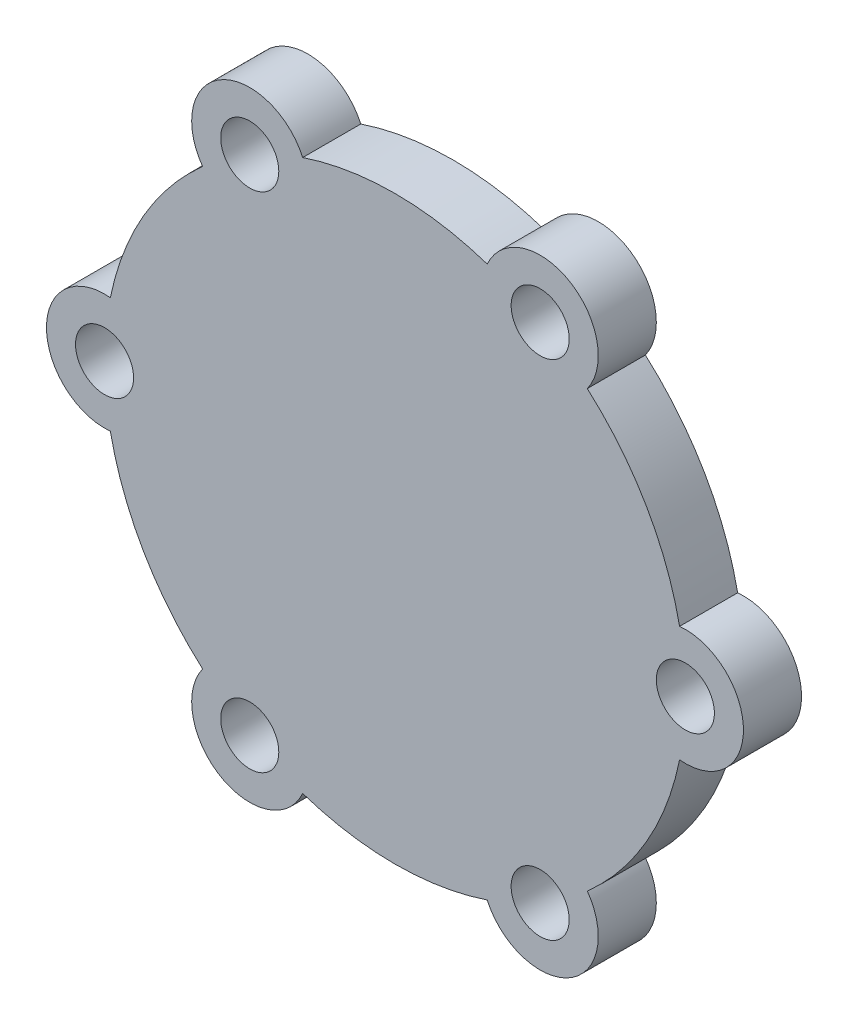
ISO-10303-21;
HEADER;
FILE_DESCRIPTION(('STEP AP214'),'2;1');
FILE_NAME('part.step','',(''),(''),'','','');
FILE_SCHEMA(('AUTOMOTIVE_DESIGN { 1 0 10303 214 1 1 1 1 }'));
ENDSEC;
DATA;
#1=APPLICATION_CONTEXT('core data for automotive mechanical design processes');
#2=APPLICATION_PROTOCOL_DEFINITION('international standard','automotive_design',2000,#1);
#3=PRODUCT_CONTEXT('',#1,'mechanical');
#4=PRODUCT('Part','Part','',(#3));
#5=PRODUCT_RELATED_PRODUCT_CATEGORY('part','',(#4));
#6=PRODUCT_DEFINITION_FORMATION('','',#4);
#7=PRODUCT_DEFINITION_CONTEXT('part definition',#1,'design');
#8=PRODUCT_DEFINITION('design','',#6,#7);
#9=PRODUCT_DEFINITION_SHAPE('','',#8);
#10=(LENGTH_UNIT() NAMED_UNIT(*) SI_UNIT(.MILLI.,.METRE.));
#11=(NAMED_UNIT(*) PLANE_ANGLE_UNIT() SI_UNIT($,.RADIAN.));
#12=(NAMED_UNIT(*) SI_UNIT($,.STERADIAN.) SOLID_ANGLE_UNIT());
#13=UNCERTAINTY_MEASURE_WITH_UNIT(LENGTH_MEASURE(1.E-05),#10,'distance_accuracy_value','');
#14=(GEOMETRIC_REPRESENTATION_CONTEXT(3) GLOBAL_UNCERTAINTY_ASSIGNED_CONTEXT((#13)) GLOBAL_UNIT_ASSIGNED_CONTEXT((#10,
#11,#12)) REPRESENTATION_CONTEXT('',''));
#15=CARTESIAN_POINT('',(0.,0.,0.));
#16=DIRECTION('',(0.,0.,1.));
#17=DIRECTION('',(1.,0.,0.));
#18=AXIS2_PLACEMENT_3D('',#15,#16,#17);
#19=CARTESIAN_POINT('',(25.,0.,10.));
#20=DIRECTION('',(0.,0.,1.));
#21=DIRECTION('',(1.,0.,0.));
#22=AXIS2_PLACEMENT_3D('',#19,#20,#21);
#23=PLANE('',#22);
#24=CARTESIAN_POINT('',(-24.9999999999996,43.3012701892222,10.));
#25=DIRECTION('',(0.,0.,1.));
#26=DIRECTION('',(1.,0.,0.));
#27=AXIS2_PLACEMENT_3D('',#24,#25,#26);
#28=CIRCLE('',#27,4.99999999999999);
#29=CARTESIAN_POINT('',(-19.9999999999996,43.3012701892222,10.));
#30=VERTEX_POINT('',#29);
#31=EDGE_CURVE('E303',#30,#30,#28,.T.);
#32=ORIENTED_EDGE('',*,*,#31,.F.);
#33=EDGE_LOOP('',(#32));
#34=FACE_BOUND('',#33,.T.);
#35=CARTESIAN_POINT('',(-25.0000000000002,-43.3012701892218,10.));
#36=DIRECTION('',(0.,0.,1.));
#37=DIRECTION('',(1.,0.,0.));
#38=AXIS2_PLACEMENT_3D('',#35,#36,#37);
#39=CIRCLE('',#38,5.);
#40=CARTESIAN_POINT('',(-20.0000000000002,-43.3012701892218,10.));
#41=VERTEX_POINT('',#40);
#42=EDGE_CURVE('E315',#41,#41,#39,.T.);
#43=ORIENTED_EDGE('',*,*,#42,.F.);
#44=EDGE_LOOP('',(#43));
#45=FACE_BOUND('',#44,.T.);
#46=CARTESIAN_POINT('',(50.,0.,10.));
#47=DIRECTION('',(0.,0.,1.));
#48=DIRECTION('',(1.,0.,0.));
#49=AXIS2_PLACEMENT_3D('',#46,#47,#48);
#50=CIRCLE('',#49,5.);
#51=CARTESIAN_POINT('',(55.,0.,10.));
#52=VERTEX_POINT('',#51);
#53=EDGE_CURVE('E162',#52,#52,#50,.T.);
#54=ORIENTED_EDGE('',*,*,#53,.F.);
#55=EDGE_LOOP('',(#54));
#56=FACE_BOUND('',#55,.T.);
#57=CARTESIAN_POINT('',(0.,0.,10.));
#58=DIRECTION('',(0.,0.,1.));
#59=DIRECTION('',(1.,0.,0.));
#60=AXIS2_PLACEMENT_3D('',#57,#58,#59);
#61=CIRCLE('',#60,50.);
#62=CARTESIAN_POINT('',(33.116843969807,-37.4603075999045,10.));
#63=VERTEX_POINT('',#62);
#64=CARTESIAN_POINT('',(49.,-9.94987437106621,10.));
#65=VERTEX_POINT('',#64);
#66=EDGE_CURVE('E181',#63,#65,#61,.T.);
#67=ORIENTED_EDGE('',*,*,#66,.T.);
#68=CARTESIAN_POINT('',(50.,0.,10.));
#69=DIRECTION('',(0.,0.,1.));
#70=DIRECTION('',(1.,0.,0.));
#71=AXIS2_PLACEMENT_3D('',#68,#69,#70);
#72=CIRCLE('',#71,10.);
#73=CARTESIAN_POINT('',(49.,9.94987437106621,10.));
#74=VERTEX_POINT('',#73);
#75=EDGE_CURVE('E109',#65,#74,#72,.T.);
#76=ORIENTED_EDGE('',*,*,#75,.T.);
#77=CARTESIAN_POINT('',(0.,0.,10.));
#78=DIRECTION('',(0.,0.,1.));
#79=DIRECTION('',(1.,0.,0.));
#80=AXIS2_PLACEMENT_3D('',#77,#78,#79);
#81=CIRCLE('',#80,50.);
#82=CARTESIAN_POINT('',(33.1168439698075,37.460307599904,10.));
#83=VERTEX_POINT('',#82);
#84=EDGE_CURVE('E208',#74,#83,#81,.T.);
#85=ORIENTED_EDGE('',*,*,#84,.T.);
#86=CARTESIAN_POINT('',(25.0000000000005,43.3012701892216,10.));
#87=DIRECTION('',(0.,0.,1.));
#88=DIRECTION('',(1.,0.,0.));
#89=AXIS2_PLACEMENT_3D('',#86,#87,#88);
#90=CIRCLE('',#89,10.);
#91=CARTESIAN_POINT('',(15.8831560301935,47.4101819709704,10.));
#92=VERTEX_POINT('',#91);
#93=EDGE_CURVE('E227',#83,#92,#90,.T.);
#94=ORIENTED_EDGE('',*,*,#93,.T.);
#95=CARTESIAN_POINT('',(0.,0.,10.));
#96=DIRECTION('',(0.,0.,1.));
#97=DIRECTION('',(1.,0.,0.));
#98=AXIS2_PLACEMENT_3D('',#95,#96,#97);
#99=CIRCLE('',#98,50.);
#100=CARTESIAN_POINT('',(-15.8831560301925,47.4101819709708,10.));
#101=VERTEX_POINT('',#100);
#102=EDGE_CURVE('E224',#92,#101,#99,.T.);
#103=ORIENTED_EDGE('',*,*,#102,.T.);
#104=CARTESIAN_POINT('',(-24.9999999999996,43.3012701892222,10.));
#105=DIRECTION('',(0.,0.,1.));
#106=DIRECTION('',(1.,0.,0.));
#107=AXIS2_PLACEMENT_3D('',#104,#105,#106);
#108=CIRCLE('',#107,10.);
#109=CARTESIAN_POINT('',(-33.1168439698067,37.4603075999047,10.));
#110=VERTEX_POINT('',#109);
#111=EDGE_CURVE('E226',#101,#110,#108,.T.);
#112=ORIENTED_EDGE('',*,*,#111,.T.);
#113=CARTESIAN_POINT('',(0.,0.,10.));
#114=DIRECTION('',(0.,0.,1.));
#115=DIRECTION('',(1.,0.,0.));
#116=AXIS2_PLACEMENT_3D('',#113,#114,#115);
#117=CIRCLE('',#116,50.);
#118=CARTESIAN_POINT('',(-48.9999999999999,9.94987437106655,10.));
#119=VERTEX_POINT('',#118);
#120=EDGE_CURVE('E229',#110,#119,#117,.T.);
#121=ORIENTED_EDGE('',*,*,#120,.T.);
#122=CARTESIAN_POINT('',(-50.,3.49148133884313E-13,10.));
#123=DIRECTION('',(0.,0.,1.));
#124=DIRECTION('',(1.,0.,0.));
#125=AXIS2_PLACEMENT_3D('',#122,#123,#124);
#126=CIRCLE('',#125,10.);
#127=CARTESIAN_POINT('',(-49.0000000000001,-9.94987437106587,10.));
#128=VERTEX_POINT('',#127);
#129=EDGE_CURVE('E235',#119,#128,#126,.T.);
#130=ORIENTED_EDGE('',*,*,#129,.T.);
#131=CARTESIAN_POINT('',(0.,0.,10.));
#132=DIRECTION('',(0.,0.,1.));
#133=DIRECTION('',(1.,0.,0.));
#134=AXIS2_PLACEMENT_3D('',#131,#132,#133);
#135=CIRCLE('',#134,50.);
#136=CARTESIAN_POINT('',(-33.1168439698072,-37.4603075999042,10.));
#137=VERTEX_POINT('',#136);
#138=EDGE_CURVE('E140',#128,#137,#135,.T.);
#139=ORIENTED_EDGE('',*,*,#138,.T.);
#140=CARTESIAN_POINT('',(-25.0000000000002,-43.3012701892218,10.));
#141=DIRECTION('',(0.,0.,1.));
#142=DIRECTION('',(1.,0.,0.));
#143=AXIS2_PLACEMENT_3D('',#140,#141,#142);
#144=CIRCLE('',#143,10.);
#145=CARTESIAN_POINT('',(-15.8831560301932,-47.4101819709705,10.));
#146=VERTEX_POINT('',#145);
#147=EDGE_CURVE('E134',#137,#146,#144,.T.);
#148=ORIENTED_EDGE('',*,*,#147,.T.);
#149=CARTESIAN_POINT('',(0.,0.,10.));
#150=DIRECTION('',(0.,0.,1.));
#151=DIRECTION('',(1.,0.,0.));
#152=AXIS2_PLACEMENT_3D('',#149,#150,#151);
#153=CIRCLE('',#152,50.);
#154=CARTESIAN_POINT('',(15.8831560301928,-47.4101819709706,10.));
#155=VERTEX_POINT('',#154);
#156=EDGE_CURVE('E138',#146,#155,#153,.T.);
#157=ORIENTED_EDGE('',*,*,#156,.T.);
#158=CARTESIAN_POINT('',(24.9999999999999,-43.301270189222,10.));
#159=DIRECTION('',(0.,0.,1.));
#160=DIRECTION('',(1.,0.,0.));
#161=AXIS2_PLACEMENT_3D('',#158,#159,#160);
#162=CIRCLE('',#161,10.);
#163=EDGE_CURVE('E54',#155,#63,#162,.T.);
#164=ORIENTED_EDGE('',*,*,#163,.T.);
#165=EDGE_LOOP('',(#67,#76,#85,#94,#103,#112,#121,#130,#139,#148,#157,#164));
#166=FACE_BOUND('',#165,.T.);
#167=CARTESIAN_POINT('',(24.9999999999999,-43.301270189222,10.));
#168=DIRECTION('',(0.,0.,1.));
#169=DIRECTION('',(1.,0.,0.));
#170=AXIS2_PLACEMENT_3D('',#167,#168,#169);
#171=CIRCLE('',#170,5.);
#172=CARTESIAN_POINT('',(29.9999999999999,-43.301270189222,10.));
#173=VERTEX_POINT('',#172);
#174=EDGE_CURVE('E321',#173,#173,#171,.T.);
#175=ORIENTED_EDGE('',*,*,#174,.F.);
#176=EDGE_LOOP('',(#175));
#177=FACE_BOUND('',#176,.T.);
#178=CARTESIAN_POINT('',(-50.,3.49148133884313E-13,10.));
#179=DIRECTION('',(0.,0.,1.));
#180=DIRECTION('',(1.,0.,0.));
#181=AXIS2_PLACEMENT_3D('',#178,#179,#180);
#182=CIRCLE('',#181,4.99999999999999);
#183=CARTESIAN_POINT('',(-45.,3.49148133884313E-13,10.));
#184=VERTEX_POINT('',#183);
#185=EDGE_CURVE('E309',#184,#184,#182,.T.);
#186=ORIENTED_EDGE('',*,*,#185,.F.);
#187=EDGE_LOOP('',(#186));
#188=FACE_BOUND('',#187,.T.);
#189=CARTESIAN_POINT('',(25.0000000000005,43.3012701892216,10.));
#190=DIRECTION('',(0.,0.,1.));
#191=DIRECTION('',(1.,0.,0.));
#192=AXIS2_PLACEMENT_3D('',#189,#190,#191);
#193=CIRCLE('',#192,5.);
#194=CARTESIAN_POINT('',(30.0000000000005,43.3012701892216,10.));
#195=VERTEX_POINT('',#194);
#196=EDGE_CURVE('E294',#195,#195,#193,.T.);
#197=ORIENTED_EDGE('',*,*,#196,.F.);
#198=EDGE_LOOP('',(#197));
#199=FACE_BOUND('',#198,.T.);
#200=ADVANCED_FACE('F37',(#34,#45,#56,#166,#177,#188,#199),#23,.T.);
#201=CARTESIAN_POINT('',(25.,0.,0.));
#202=DIRECTION('',(0.,0.,1.));
#203=DIRECTION('',(1.,0.,0.));
#204=AXIS2_PLACEMENT_3D('',#201,#202,#203);
#205=PLANE('',#204);
#206=CARTESIAN_POINT('',(0.,0.,0.));
#207=DIRECTION('',(0.,0.,1.));
#208=DIRECTION('',(1.,0.,0.));
#209=AXIS2_PLACEMENT_3D('',#206,#207,#208);
#210=CIRCLE('',#209,50.);
#211=CARTESIAN_POINT('',(33.116843969807,-37.4603075999045,0.));
#212=VERTEX_POINT('',#211);
#213=CARTESIAN_POINT('',(49.,-9.94987437106621,0.));
#214=VERTEX_POINT('',#213);
#215=EDGE_CURVE('E158',#212,#214,#210,.T.);
#216=ORIENTED_EDGE('',*,*,#215,.F.);
#217=CARTESIAN_POINT('',(24.9999999999999,-43.301270189222,0.));
#218=DIRECTION('',(0.,0.,1.));
#219=DIRECTION('',(1.,0.,0.));
#220=AXIS2_PLACEMENT_3D('',#217,#218,#219);
#221=CIRCLE('',#220,10.);
#222=CARTESIAN_POINT('',(15.8831560301928,-47.4101819709706,0.));
#223=VERTEX_POINT('',#222);
#224=EDGE_CURVE('E101',#223,#212,#221,.T.);
#225=ORIENTED_EDGE('',*,*,#224,.F.);
#226=CARTESIAN_POINT('',(0.,0.,0.));
#227=DIRECTION('',(0.,0.,1.));
#228=DIRECTION('',(1.,0.,0.));
#229=AXIS2_PLACEMENT_3D('',#226,#227,#228);
#230=CIRCLE('',#229,50.);
#231=CARTESIAN_POINT('',(-15.8831560301932,-47.4101819709705,0.));
#232=VERTEX_POINT('',#231);
#233=EDGE_CURVE('E95',#232,#223,#230,.T.);
#234=ORIENTED_EDGE('',*,*,#233,.F.);
#235=CARTESIAN_POINT('',(-25.0000000000002,-43.3012701892218,0.));
#236=DIRECTION('',(0.,0.,1.));
#237=DIRECTION('',(1.,0.,0.));
#238=AXIS2_PLACEMENT_3D('',#235,#236,#237);
#239=CIRCLE('',#238,10.);
#240=CARTESIAN_POINT('',(-33.1168439698072,-37.4603075999042,0.));
#241=VERTEX_POINT('',#240);
#242=EDGE_CURVE('E148',#241,#232,#239,.T.);
#243=ORIENTED_EDGE('',*,*,#242,.F.);
#244=CARTESIAN_POINT('',(0.,0.,0.));
#245=DIRECTION('',(0.,0.,1.));
#246=DIRECTION('',(1.,0.,0.));
#247=AXIS2_PLACEMENT_3D('',#244,#245,#246);
#248=CIRCLE('',#247,50.);
#249=CARTESIAN_POINT('',(-49.0000000000001,-9.94987437106587,0.));
#250=VERTEX_POINT('',#249);
#251=EDGE_CURVE('E176',#250,#241,#248,.T.);
#252=ORIENTED_EDGE('',*,*,#251,.F.);
#253=CARTESIAN_POINT('',(-50.,3.49148133884313E-13,0.));
#254=DIRECTION('',(0.,0.,1.));
#255=DIRECTION('',(1.,0.,0.));
#256=AXIS2_PLACEMENT_3D('',#253,#254,#255);
#257=CIRCLE('',#256,10.);
#258=CARTESIAN_POINT('',(-48.9999999999999,9.94987437106655,0.));
#259=VERTEX_POINT('',#258);
#260=EDGE_CURVE('E174',#259,#250,#257,.T.);
#261=ORIENTED_EDGE('',*,*,#260,.F.);
#262=CARTESIAN_POINT('',(0.,0.,0.));
#263=DIRECTION('',(0.,0.,1.));
#264=DIRECTION('',(1.,0.,0.));
#265=AXIS2_PLACEMENT_3D('',#262,#263,#264);
#266=CIRCLE('',#265,50.);
#267=CARTESIAN_POINT('',(-33.1168439698067,37.4603075999047,0.));
#268=VERTEX_POINT('',#267);
#269=EDGE_CURVE('E172',#268,#259,#266,.T.);
#270=ORIENTED_EDGE('',*,*,#269,.F.);
#271=CARTESIAN_POINT('',(-24.9999999999996,43.3012701892222,0.));
#272=DIRECTION('',(0.,0.,1.));
#273=DIRECTION('',(1.,0.,0.));
#274=AXIS2_PLACEMENT_3D('',#271,#272,#273);
#275=CIRCLE('',#274,10.);
#276=CARTESIAN_POINT('',(-15.8831560301925,47.4101819709708,0.));
#277=VERTEX_POINT('',#276);
#278=EDGE_CURVE('E170',#277,#268,#275,.T.);
#279=ORIENTED_EDGE('',*,*,#278,.F.);
#280=CARTESIAN_POINT('',(0.,0.,0.));
#281=DIRECTION('',(0.,0.,1.));
#282=DIRECTION('',(1.,0.,0.));
#283=AXIS2_PLACEMENT_3D('',#280,#281,#282);
#284=CIRCLE('',#283,50.);
#285=CARTESIAN_POINT('',(15.8831560301935,47.4101819709704,0.));
#286=VERTEX_POINT('',#285);
#287=EDGE_CURVE('E168',#286,#277,#284,.T.);
#288=ORIENTED_EDGE('',*,*,#287,.F.);
#289=CARTESIAN_POINT('',(25.0000000000005,43.3012701892216,0.));
#290=DIRECTION('',(0.,0.,1.));
#291=DIRECTION('',(1.,0.,0.));
#292=AXIS2_PLACEMENT_3D('',#289,#290,#291);
#293=CIRCLE('',#292,10.);
#294=CARTESIAN_POINT('',(33.1168439698075,37.460307599904,0.));
#295=VERTEX_POINT('',#294);
#296=EDGE_CURVE('E166',#295,#286,#293,.T.);
#297=ORIENTED_EDGE('',*,*,#296,.F.);
#298=CARTESIAN_POINT('',(0.,0.,0.));
#299=DIRECTION('',(0.,0.,1.));
#300=DIRECTION('',(1.,0.,0.));
#301=AXIS2_PLACEMENT_3D('',#298,#299,#300);
#302=CIRCLE('',#301,50.);
#303=CARTESIAN_POINT('',(49.,9.94987437106621,0.));
#304=VERTEX_POINT('',#303);
#305=EDGE_CURVE('E164',#304,#295,#302,.T.);
#306=ORIENTED_EDGE('',*,*,#305,.F.);
#307=CARTESIAN_POINT('',(50.,0.,0.));
#308=DIRECTION('',(0.,0.,1.));
#309=DIRECTION('',(1.,0.,0.));
#310=AXIS2_PLACEMENT_3D('',#307,#308,#309);
#311=CIRCLE('',#310,10.);
#312=EDGE_CURVE('E161',#214,#304,#311,.T.);
#313=ORIENTED_EDGE('',*,*,#312,.F.);
#314=EDGE_LOOP('',(#216,#225,#234,#243,#252,#261,#270,#279,#288,#297,#306,#313));
#315=FACE_BOUND('',#314,.T.);
#316=CARTESIAN_POINT('',(50.,0.,0.));
#317=DIRECTION('',(0.,0.,1.));
#318=DIRECTION('',(1.,0.,0.));
#319=AXIS2_PLACEMENT_3D('',#316,#317,#318);
#320=CIRCLE('',#319,5.);
#321=CARTESIAN_POINT('',(55.,0.,0.));
#322=VERTEX_POINT('',#321);
#323=EDGE_CURVE('E324',#322,#322,#320,.T.);
#324=ORIENTED_EDGE('',*,*,#323,.T.);
#325=EDGE_LOOP('',(#324));
#326=FACE_BOUND('',#325,.T.);
#327=CARTESIAN_POINT('',(24.9999999999999,-43.301270189222,0.));
#328=DIRECTION('',(0.,0.,1.));
#329=DIRECTION('',(1.,0.,0.));
#330=AXIS2_PLACEMENT_3D('',#327,#328,#329);
#331=CIRCLE('',#330,5.);
#332=CARTESIAN_POINT('',(29.9999999999999,-43.301270189222,0.));
#333=VERTEX_POINT('',#332);
#334=EDGE_CURVE('E318',#333,#333,#331,.T.);
#335=ORIENTED_EDGE('',*,*,#334,.T.);
#336=EDGE_LOOP('',(#335));
#337=FACE_BOUND('',#336,.T.);
#338=CARTESIAN_POINT('',(-25.0000000000002,-43.3012701892218,0.));
#339=DIRECTION('',(0.,0.,1.));
#340=DIRECTION('',(1.,0.,0.));
#341=AXIS2_PLACEMENT_3D('',#338,#339,#340);
#342=CIRCLE('',#341,5.);
#343=CARTESIAN_POINT('',(-20.0000000000002,-43.3012701892218,0.));
#344=VERTEX_POINT('',#343);
#345=EDGE_CURVE('E312',#344,#344,#342,.T.);
#346=ORIENTED_EDGE('',*,*,#345,.T.);
#347=EDGE_LOOP('',(#346));
#348=FACE_BOUND('',#347,.T.);
#349=CARTESIAN_POINT('',(-50.,3.49148133884313E-13,0.));
#350=DIRECTION('',(0.,0.,1.));
#351=DIRECTION('',(1.,0.,0.));
#352=AXIS2_PLACEMENT_3D('',#349,#350,#351);
#353=CIRCLE('',#352,4.99999999999999);
#354=CARTESIAN_POINT('',(-45.,3.49148133884313E-13,0.));
#355=VERTEX_POINT('',#354);
#356=EDGE_CURVE('E306',#355,#355,#353,.T.);
#357=ORIENTED_EDGE('',*,*,#356,.T.);
#358=EDGE_LOOP('',(#357));
#359=FACE_BOUND('',#358,.T.);
#360=CARTESIAN_POINT('',(-24.9999999999996,43.3012701892222,0.));
#361=DIRECTION('',(0.,0.,1.));
#362=DIRECTION('',(1.,0.,0.));
#363=AXIS2_PLACEMENT_3D('',#360,#361,#362);
#364=CIRCLE('',#363,4.99999999999999);
#365=CARTESIAN_POINT('',(-19.9999999999996,43.3012701892222,0.));
#366=VERTEX_POINT('',#365);
#367=EDGE_CURVE('E300',#366,#366,#364,.T.);
#368=ORIENTED_EDGE('',*,*,#367,.T.);
#369=EDGE_LOOP('',(#368));
#370=FACE_BOUND('',#369,.T.);
#371=CARTESIAN_POINT('',(25.0000000000005,43.3012701892216,0.));
#372=DIRECTION('',(0.,0.,1.));
#373=DIRECTION('',(1.,0.,0.));
#374=AXIS2_PLACEMENT_3D('',#371,#372,#373);
#375=CIRCLE('',#374,5.);
#376=CARTESIAN_POINT('',(30.0000000000005,43.3012701892216,0.));
#377=VERTEX_POINT('',#376);
#378=EDGE_CURVE('E297',#377,#377,#375,.T.);
#379=ORIENTED_EDGE('',*,*,#378,.T.);
#380=EDGE_LOOP('',(#379));
#381=FACE_BOUND('',#380,.T.);
#382=ADVANCED_FACE('F212',(#315,#326,#337,#348,#359,#370,#381),#205,.F.);
#383=CARTESIAN_POINT('',(0.,0.,10.));
#384=DIRECTION('',(0.,0.,-1.));
#385=DIRECTION('',(-1.,0.,0.));
#386=AXIS2_PLACEMENT_3D('',#383,#384,#385);
#387=CYLINDRICAL_SURFACE('',#386,50.);
#388=ORIENTED_EDGE('',*,*,#215,.T.);
#389=DIRECTION('',(0.,0.,-1.));
#390=VECTOR('',#389,1.);
#391=CARTESIAN_POINT('',(49.,-9.94987437106621,10.));
#392=LINE('',#391,#390);
#393=EDGE_CURVE('E11',#65,#214,#392,.T.);
#394=ORIENTED_EDGE('',*,*,#393,.F.);
#395=ORIENTED_EDGE('',*,*,#66,.F.);
#396=DIRECTION('',(0.,0.,-1.));
#397=VECTOR('',#396,1.);
#398=CARTESIAN_POINT('',(33.116843969807,-37.4603075999045,10.));
#399=LINE('',#398,#397);
#400=EDGE_CURVE('E154',#63,#212,#399,.T.);
#401=ORIENTED_EDGE('',*,*,#400,.T.);
#402=EDGE_LOOP('',(#388,#394,#395,#401));
#403=FACE_BOUND('',#402,.T.);
#404=ADVANCED_FACE('F39',(#403),#387,.T.);
#405=CARTESIAN_POINT('',(50.,0.,10.));
#406=DIRECTION('',(0.,0.,-1.));
#407=DIRECTION('',(-1.,0.,0.));
#408=AXIS2_PLACEMENT_3D('',#405,#406,#407);
#409=CYLINDRICAL_SURFACE('',#408,10.);
#410=ORIENTED_EDGE('',*,*,#312,.T.);
#411=DIRECTION('',(0.,0.,-1.));
#412=VECTOR('',#411,1.);
#413=CARTESIAN_POINT('',(49.,9.94987437106621,10.));
#414=LINE('',#413,#412);
#415=EDGE_CURVE('E46',#74,#304,#414,.T.);
#416=ORIENTED_EDGE('',*,*,#415,.F.);
#417=ORIENTED_EDGE('',*,*,#75,.F.);
#418=ORIENTED_EDGE('',*,*,#393,.T.);
#419=EDGE_LOOP('',(#410,#416,#417,#418));
#420=FACE_BOUND('',#419,.T.);
#421=ADVANCED_FACE('F462',(#420),#409,.T.);
#422=CARTESIAN_POINT('',(0.,0.,10.));
#423=DIRECTION('',(0.,0.,-1.));
#424=DIRECTION('',(-1.,0.,0.));
#425=AXIS2_PLACEMENT_3D('',#422,#423,#424);
#426=CYLINDRICAL_SURFACE('',#425,50.);
#427=ORIENTED_EDGE('',*,*,#305,.T.);
#428=DIRECTION('',(0.,0.,-1.));
#429=VECTOR('',#428,1.);
#430=CARTESIAN_POINT('',(33.1168439698075,37.460307599904,10.));
#431=LINE('',#430,#429);
#432=EDGE_CURVE('E200',#83,#295,#431,.T.);
#433=ORIENTED_EDGE('',*,*,#432,.F.);
#434=ORIENTED_EDGE('',*,*,#84,.F.);
#435=ORIENTED_EDGE('',*,*,#415,.T.);
#436=EDGE_LOOP('',(#427,#433,#434,#435));
#437=FACE_BOUND('',#436,.T.);
#438=ADVANCED_FACE('F206',(#437),#426,.T.);
#439=CARTESIAN_POINT('',(25.0000000000005,43.3012701892216,10.));
#440=DIRECTION('',(0.,0.,-1.));
#441=DIRECTION('',(-1.,0.,0.));
#442=AXIS2_PLACEMENT_3D('',#439,#440,#441);
#443=CYLINDRICAL_SURFACE('',#442,10.);
#444=ORIENTED_EDGE('',*,*,#296,.T.);
#445=DIRECTION('',(0.,0.,-1.));
#446=VECTOR('',#445,1.);
#447=CARTESIAN_POINT('',(15.8831560301935,47.4101819709704,10.));
#448=LINE('',#447,#446);
#449=EDGE_CURVE('E197',#92,#286,#448,.T.);
#450=ORIENTED_EDGE('',*,*,#449,.F.);
#451=ORIENTED_EDGE('',*,*,#93,.F.);
#452=ORIENTED_EDGE('',*,*,#432,.T.);
#453=EDGE_LOOP('',(#444,#450,#451,#452));
#454=FACE_BOUND('',#453,.T.);
#455=ADVANCED_FACE('F218',(#454),#443,.T.);
#456=CARTESIAN_POINT('',(0.,0.,10.));
#457=DIRECTION('',(0.,0.,-1.));
#458=DIRECTION('',(-1.,0.,0.));
#459=AXIS2_PLACEMENT_3D('',#456,#457,#458);
#460=CYLINDRICAL_SURFACE('',#459,50.);
#461=ORIENTED_EDGE('',*,*,#287,.T.);
#462=DIRECTION('',(0.,0.,-1.));
#463=VECTOR('',#462,1.);
#464=CARTESIAN_POINT('',(-15.8831560301925,47.4101819709708,10.));
#465=LINE('',#464,#463);
#466=EDGE_CURVE('E194',#101,#277,#465,.T.);
#467=ORIENTED_EDGE('',*,*,#466,.F.);
#468=ORIENTED_EDGE('',*,*,#102,.F.);
#469=ORIENTED_EDGE('',*,*,#449,.T.);
#470=EDGE_LOOP('',(#461,#467,#468,#469));
#471=FACE_BOUND('',#470,.T.);
#472=ADVANCED_FACE('F222',(#471),#460,.T.);
#473=CARTESIAN_POINT('',(-24.9999999999996,43.3012701892222,10.));
#474=DIRECTION('',(0.,0.,-1.));
#475=DIRECTION('',(-1.,0.,0.));
#476=AXIS2_PLACEMENT_3D('',#473,#474,#475);
#477=CYLINDRICAL_SURFACE('',#476,10.);
#478=ORIENTED_EDGE('',*,*,#278,.T.);
#479=DIRECTION('',(0.,0.,-1.));
#480=VECTOR('',#479,1.);
#481=CARTESIAN_POINT('',(-33.1168439698067,37.4603075999047,10.));
#482=LINE('',#481,#480);
#483=EDGE_CURVE('E191',#110,#268,#482,.T.);
#484=ORIENTED_EDGE('',*,*,#483,.F.);
#485=ORIENTED_EDGE('',*,*,#111,.F.);
#486=ORIENTED_EDGE('',*,*,#466,.T.);
#487=EDGE_LOOP('',(#478,#484,#485,#486));
#488=FACE_BOUND('',#487,.T.);
#489=ADVANCED_FACE('F423',(#488),#477,.T.);
#490=CARTESIAN_POINT('',(0.,0.,10.));
#491=DIRECTION('',(0.,0.,-1.));
#492=DIRECTION('',(-1.,0.,0.));
#493=AXIS2_PLACEMENT_3D('',#490,#491,#492);
#494=CYLINDRICAL_SURFACE('',#493,50.);
#495=ORIENTED_EDGE('',*,*,#269,.T.);
#496=DIRECTION('',(0.,0.,-1.));
#497=VECTOR('',#496,1.);
#498=CARTESIAN_POINT('',(-48.9999999999999,9.94987437106655,10.));
#499=LINE('',#498,#497);
#500=EDGE_CURVE('E188',#119,#259,#499,.T.);
#501=ORIENTED_EDGE('',*,*,#500,.F.);
#502=ORIENTED_EDGE('',*,*,#120,.F.);
#503=ORIENTED_EDGE('',*,*,#483,.T.);
#504=EDGE_LOOP('',(#495,#501,#502,#503));
#505=FACE_BOUND('',#504,.T.);
#506=ADVANCED_FACE('F413',(#505),#494,.T.);
#507=CARTESIAN_POINT('',(-50.,3.49148133884313E-13,10.));
#508=DIRECTION('',(0.,0.,-1.));
#509=DIRECTION('',(-1.,0.,0.));
#510=AXIS2_PLACEMENT_3D('',#507,#508,#509);
#511=CYLINDRICAL_SURFACE('',#510,10.);
#512=ORIENTED_EDGE('',*,*,#260,.T.);
#513=DIRECTION('',(0.,0.,-1.));
#514=VECTOR('',#513,1.);
#515=CARTESIAN_POINT('',(-49.0000000000001,-9.94987437106587,10.));
#516=LINE('',#515,#514);
#517=EDGE_CURVE('E185',#128,#250,#516,.T.);
#518=ORIENTED_EDGE('',*,*,#517,.F.);
#519=ORIENTED_EDGE('',*,*,#129,.F.);
#520=ORIENTED_EDGE('',*,*,#500,.T.);
#521=EDGE_LOOP('',(#512,#518,#519,#520));
#522=FACE_BOUND('',#521,.T.);
#523=ADVANCED_FACE('F241',(#522),#511,.T.);
#524=CARTESIAN_POINT('',(0.,0.,10.));
#525=DIRECTION('',(0.,0.,-1.));
#526=DIRECTION('',(-1.,0.,0.));
#527=AXIS2_PLACEMENT_3D('',#524,#525,#526);
#528=CYLINDRICAL_SURFACE('',#527,50.);
#529=ORIENTED_EDGE('',*,*,#251,.T.);
#530=DIRECTION('',(0.,0.,-1.));
#531=VECTOR('',#530,1.);
#532=CARTESIAN_POINT('',(-33.1168439698072,-37.4603075999042,10.));
#533=LINE('',#532,#531);
#534=EDGE_CURVE('E149',#137,#241,#533,.T.);
#535=ORIENTED_EDGE('',*,*,#534,.F.);
#536=ORIENTED_EDGE('',*,*,#138,.F.);
#537=ORIENTED_EDGE('',*,*,#517,.T.);
#538=EDGE_LOOP('',(#529,#535,#536,#537));
#539=FACE_BOUND('',#538,.T.);
#540=ADVANCED_FACE('F245',(#539),#528,.T.);
#541=CARTESIAN_POINT('',(-25.0000000000002,-43.3012701892218,10.));
#542=DIRECTION('',(0.,0.,-1.));
#543=DIRECTION('',(-1.,0.,0.));
#544=AXIS2_PLACEMENT_3D('',#541,#542,#543);
#545=CYLINDRICAL_SURFACE('',#544,10.);
#546=ORIENTED_EDGE('',*,*,#242,.T.);
#547=DIRECTION('',(0.,0.,-1.));
#548=VECTOR('',#547,1.);
#549=CARTESIAN_POINT('',(-15.8831560301932,-47.4101819709705,10.));
#550=LINE('',#549,#548);
#551=EDGE_CURVE('E145',#146,#232,#550,.T.);
#552=ORIENTED_EDGE('',*,*,#551,.F.);
#553=ORIENTED_EDGE('',*,*,#147,.F.);
#554=ORIENTED_EDGE('',*,*,#534,.T.);
#555=EDGE_LOOP('',(#546,#552,#553,#554));
#556=FACE_BOUND('',#555,.T.);
#557=ADVANCED_FACE('F146',(#556),#545,.T.);
#558=CARTESIAN_POINT('',(0.,0.,10.));
#559=DIRECTION('',(0.,0.,-1.));
#560=DIRECTION('',(-1.,0.,0.));
#561=AXIS2_PLACEMENT_3D('',#558,#559,#560);
#562=CYLINDRICAL_SURFACE('',#561,50.);
#563=ORIENTED_EDGE('',*,*,#233,.T.);
#564=DIRECTION('',(0.,0.,-1.));
#565=VECTOR('',#564,1.);
#566=CARTESIAN_POINT('',(15.8831560301928,-47.4101819709706,10.));
#567=LINE('',#566,#565);
#568=EDGE_CURVE('E150',#155,#223,#567,.T.);
#569=ORIENTED_EDGE('',*,*,#568,.F.);
#570=ORIENTED_EDGE('',*,*,#156,.F.);
#571=ORIENTED_EDGE('',*,*,#551,.T.);
#572=EDGE_LOOP('',(#563,#569,#570,#571));
#573=FACE_BOUND('',#572,.T.);
#574=ADVANCED_FACE('F152',(#573),#562,.T.);
#575=CARTESIAN_POINT('',(24.9999999999999,-43.301270189222,10.));
#576=DIRECTION('',(0.,0.,-1.));
#577=DIRECTION('',(-1.,0.,0.));
#578=AXIS2_PLACEMENT_3D('',#575,#576,#577);
#579=CYLINDRICAL_SURFACE('',#578,10.);
#580=ORIENTED_EDGE('',*,*,#224,.T.);
#581=ORIENTED_EDGE('',*,*,#400,.F.);
#582=ORIENTED_EDGE('',*,*,#163,.F.);
#583=ORIENTED_EDGE('',*,*,#568,.T.);
#584=EDGE_LOOP('',(#580,#581,#582,#583));
#585=FACE_BOUND('',#584,.T.);
#586=ADVANCED_FACE('F249',(#585),#579,.T.);
#587=CARTESIAN_POINT('',(50.,0.,10.));
#588=DIRECTION('',(0.,0.,-1.));
#589=DIRECTION('',(-1.,0.,0.));
#590=AXIS2_PLACEMENT_3D('',#587,#588,#589);
#591=CYLINDRICAL_SURFACE('',#590,5.);
#592=ORIENTED_EDGE('',*,*,#53,.T.);
#593=EDGE_LOOP('',(#592));
#594=FACE_BOUND('',#593,.T.);
#595=ORIENTED_EDGE('',*,*,#323,.F.);
#596=EDGE_LOOP('',(#595));
#597=FACE_BOUND('',#596,.T.);
#598=ADVANCED_FACE('F251',(#594,#597),#591,.F.);
#599=CARTESIAN_POINT('',(24.9999999999999,-43.301270189222,10.));
#600=DIRECTION('',(0.,0.,-1.));
#601=DIRECTION('',(-1.,0.,0.));
#602=AXIS2_PLACEMENT_3D('',#599,#600,#601);
#603=CYLINDRICAL_SURFACE('',#602,5.);
#604=ORIENTED_EDGE('',*,*,#174,.T.);
#605=EDGE_LOOP('',(#604));
#606=FACE_BOUND('',#605,.T.);
#607=ORIENTED_EDGE('',*,*,#334,.F.);
#608=EDGE_LOOP('',(#607));
#609=FACE_BOUND('',#608,.T.);
#610=ADVANCED_FACE('F257',(#606,#609),#603,.F.);
#611=CARTESIAN_POINT('',(-25.0000000000002,-43.3012701892218,10.));
#612=DIRECTION('',(0.,0.,-1.));
#613=DIRECTION('',(-1.,0.,0.));
#614=AXIS2_PLACEMENT_3D('',#611,#612,#613);
#615=CYLINDRICAL_SURFACE('',#614,5.);
#616=ORIENTED_EDGE('',*,*,#42,.T.);
#617=EDGE_LOOP('',(#616));
#618=FACE_BOUND('',#617,.T.);
#619=ORIENTED_EDGE('',*,*,#345,.F.);
#620=EDGE_LOOP('',(#619));
#621=FACE_BOUND('',#620,.T.);
#622=ADVANCED_FACE('F273',(#618,#621),#615,.F.);
#623=CARTESIAN_POINT('',(-50.,3.49148133884313E-13,10.));
#624=DIRECTION('',(0.,0.,-1.));
#625=DIRECTION('',(-1.,0.,0.));
#626=AXIS2_PLACEMENT_3D('',#623,#624,#625);
#627=CYLINDRICAL_SURFACE('',#626,4.99999999999999);
#628=ORIENTED_EDGE('',*,*,#185,.T.);
#629=EDGE_LOOP('',(#628));
#630=FACE_BOUND('',#629,.T.);
#631=ORIENTED_EDGE('',*,*,#356,.F.);
#632=EDGE_LOOP('',(#631));
#633=FACE_BOUND('',#632,.T.);
#634=ADVANCED_FACE('F277',(#630,#633),#627,.F.);
#635=CARTESIAN_POINT('',(-24.9999999999996,43.3012701892222,10.));
#636=DIRECTION('',(0.,0.,-1.));
#637=DIRECTION('',(-1.,0.,0.));
#638=AXIS2_PLACEMENT_3D('',#635,#636,#637);
#639=CYLINDRICAL_SURFACE('',#638,4.99999999999999);
#640=ORIENTED_EDGE('',*,*,#31,.T.);
#641=EDGE_LOOP('',(#640));
#642=FACE_BOUND('',#641,.T.);
#643=ORIENTED_EDGE('',*,*,#367,.F.);
#644=EDGE_LOOP('',(#643));
#645=FACE_BOUND('',#644,.T.);
#646=ADVANCED_FACE('F281',(#642,#645),#639,.F.);
#647=CARTESIAN_POINT('',(25.0000000000005,43.3012701892216,10.));
#648=DIRECTION('',(0.,0.,-1.));
#649=DIRECTION('',(-1.,0.,0.));
#650=AXIS2_PLACEMENT_3D('',#647,#648,#649);
#651=CYLINDRICAL_SURFACE('',#650,5.);
#652=ORIENTED_EDGE('',*,*,#196,.T.);
#653=EDGE_LOOP('',(#652));
#654=FACE_BOUND('',#653,.T.);
#655=ORIENTED_EDGE('',*,*,#378,.F.);
#656=EDGE_LOOP('',(#655));
#657=FACE_BOUND('',#656,.T.);
#658=ADVANCED_FACE('F285',(#654,#657),#651,.F.);
#659=CLOSED_SHELL('',(#200,#382,#404,#421,#438,#455,#472,#489,#506,#523,#540,#557,#574,#586,
#598,#610,#622,#634,#646,#658));
#660=MANIFOLD_SOLID_BREP('B2',#659);
#661=ADVANCED_BREP_SHAPE_REPRESENTATION('',(#18,#660),#14);
#662=SHAPE_DEFINITION_REPRESENTATION(#9,#661);
ENDSEC;
END-ISO-10303-21;
